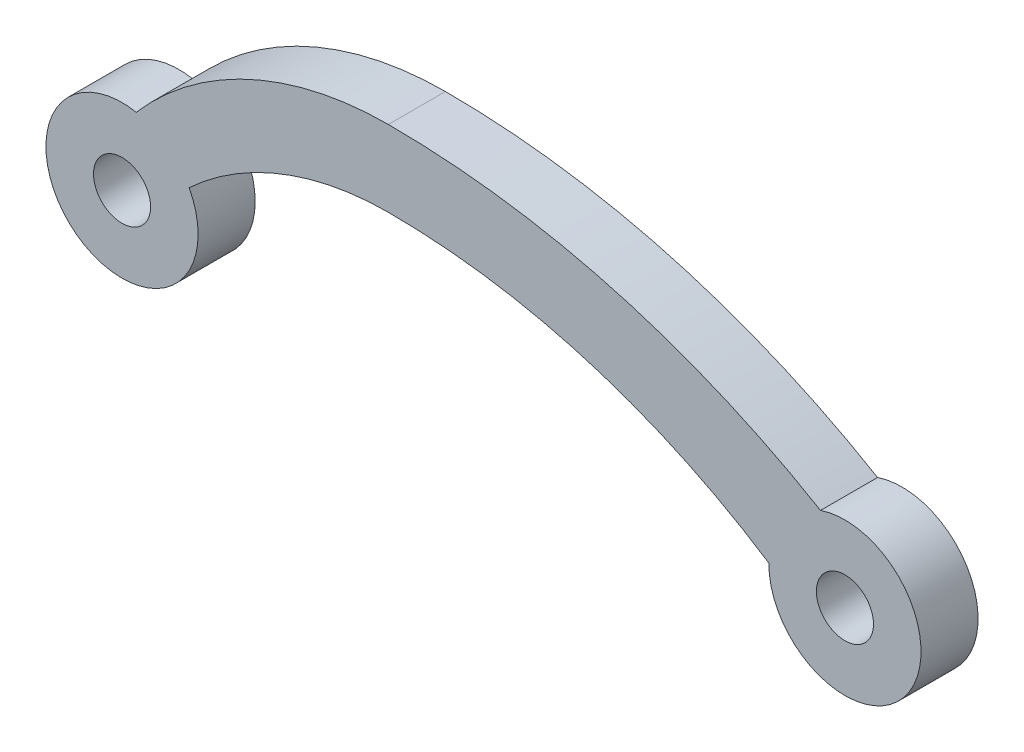
ISO-10303-21;
HEADER;
FILE_DESCRIPTION(('STEP AP214'),'2;1');
FILE_NAME('part.step','',(''),(''),'','','');
FILE_SCHEMA(('AUTOMOTIVE_DESIGN { 1 0 10303 214 1 1 1 1 }'));
ENDSEC;
DATA;
#1=APPLICATION_CONTEXT('core data for automotive mechanical design processes');
#2=APPLICATION_PROTOCOL_DEFINITION('international standard','automotive_design',2000,#1);
#3=PRODUCT_CONTEXT('',#1,'mechanical');
#4=PRODUCT('Part','Part','',(#3));
#5=PRODUCT_RELATED_PRODUCT_CATEGORY('part','',(#4));
#6=PRODUCT_DEFINITION_FORMATION('','',#4);
#7=PRODUCT_DEFINITION_CONTEXT('part definition',#1,'design');
#8=PRODUCT_DEFINITION('design','',#6,#7);
#9=PRODUCT_DEFINITION_SHAPE('','',#8);
#10=(LENGTH_UNIT() NAMED_UNIT(*) SI_UNIT(.MILLI.,.METRE.));
#11=(NAMED_UNIT(*) PLANE_ANGLE_UNIT() SI_UNIT($,.RADIAN.));
#12=(NAMED_UNIT(*) SI_UNIT($,.STERADIAN.) SOLID_ANGLE_UNIT());
#13=UNCERTAINTY_MEASURE_WITH_UNIT(LENGTH_MEASURE(1.E-05),#10,'distance_accuracy_value','');
#14=(GEOMETRIC_REPRESENTATION_CONTEXT(3) GLOBAL_UNCERTAINTY_ASSIGNED_CONTEXT((#13)) GLOBAL_UNIT_ASSIGNED_CONTEXT((#10,
#11,#12)) REPRESENTATION_CONTEXT('',''));
#15=CARTESIAN_POINT('',(0.,0.,0.));
#16=DIRECTION('',(0.,0.,1.));
#17=DIRECTION('',(1.,0.,0.));
#18=AXIS2_PLACEMENT_3D('',#15,#16,#17);
#19=CARTESIAN_POINT('',(14.,-7.49999999999998,3.));
#20=DIRECTION('',(0.,0.,-1.));
#21=DIRECTION('',(-1.,0.,0.));
#22=AXIS2_PLACEMENT_3D('',#19,#20,#21);
#23=CYLINDRICAL_SURFACE('',#22,17.5);
#24=CARTESIAN_POINT('',(14.,-7.49999999999998,0.));
#25=DIRECTION('',(0.,0.,1.));
#26=DIRECTION('',(1.,0.,0.));
#27=AXIS2_PLACEMENT_3D('',#24,#25,#26);
#28=CIRCLE('',#27,17.5);
#29=CARTESIAN_POINT('',(14.,10.,0.));
#30=VERTEX_POINT('',#29);
#31=CARTESIAN_POINT('',(0.747922049501802,3.92945449240337,0.));
#32=VERTEX_POINT('',#31);
#33=EDGE_CURVE('E221',#30,#32,#28,.T.);
#34=ORIENTED_EDGE('',*,*,#33,.T.);
#35=DIRECTION('',(0.,0.,-1.));
#36=VECTOR('',#35,1.);
#37=CARTESIAN_POINT('',(0.747922049501802,3.92945449240337,3.));
#38=LINE('',#37,#36);
#39=CARTESIAN_POINT('',(0.747922049501802,3.92945449240337,3.));
#40=VERTEX_POINT('',#39);
#41=EDGE_CURVE('E141',#40,#32,#38,.T.);
#42=ORIENTED_EDGE('',*,*,#41,.F.);
#43=CARTESIAN_POINT('',(14.,-7.49999999999998,3.));
#44=DIRECTION('',(0.,0.,1.));
#45=DIRECTION('',(1.,0.,0.));
#46=AXIS2_PLACEMENT_3D('',#43,#44,#45);
#47=CIRCLE('',#46,17.5);
#48=CARTESIAN_POINT('',(14.,10.,3.));
#49=VERTEX_POINT('',#48);
#50=EDGE_CURVE('E212',#49,#40,#47,.T.);
#51=ORIENTED_EDGE('',*,*,#50,.F.);
#52=DIRECTION('',(0.,0.,-1.));
#53=VECTOR('',#52,1.);
#54=CARTESIAN_POINT('',(14.,10.,3.));
#55=LINE('',#54,#53);
#56=EDGE_CURVE('E12',#49,#30,#55,.T.);
#57=ORIENTED_EDGE('',*,*,#56,.T.);
#58=EDGE_LOOP('',(#34,#42,#51,#57));
#59=FACE_BOUND('',#58,.T.);
#60=ADVANCED_FACE('F131',(#59),#23,.T.);
#61=CARTESIAN_POINT('',(14.,-9.38888888888889,3.));
#62=DIRECTION('',(0.,0.,-1.));
#63=DIRECTION('',(-1.,0.,0.));
#64=AXIS2_PLACEMENT_3D('',#61,#62,#63);
#65=CYLINDRICAL_SURFACE('',#64,15.3888888888889);
#66=CARTESIAN_POINT('',(14.,-9.38888888888889,0.));
#67=DIRECTION('',(0.,0.,1.));
#68=DIRECTION('',(1.,0.,0.));
#69=AXIS2_PLACEMENT_3D('',#66,#67,#68);
#70=CIRCLE('',#69,15.3888888888889);
#71=CARTESIAN_POINT('',(14.,6.,0.));
#72=VERTEX_POINT('',#71);
#73=CARTESIAN_POINT('',(3.52713505013722,1.8866155777194,0.));
#74=VERTEX_POINT('',#73);
#75=EDGE_CURVE('E194',#72,#74,#70,.T.);
#76=ORIENTED_EDGE('',*,*,#75,.F.);
#77=DIRECTION('',(0.,0.,-1.));
#78=VECTOR('',#77,1.);
#79=CARTESIAN_POINT('',(14.,6.,3.));
#80=LINE('',#79,#78);
#81=CARTESIAN_POINT('',(14.,6.,3.));
#82=VERTEX_POINT('',#81);
#83=EDGE_CURVE('E188',#82,#72,#80,.T.);
#84=ORIENTED_EDGE('',*,*,#83,.F.);
#85=CARTESIAN_POINT('',(14.,-9.38888888888889,3.));
#86=DIRECTION('',(0.,0.,1.));
#87=DIRECTION('',(1.,0.,0.));
#88=AXIS2_PLACEMENT_3D('',#85,#86,#87);
#89=CIRCLE('',#88,15.3888888888889);
#90=CARTESIAN_POINT('',(3.52713505013722,1.8866155777194,3.));
#91=VERTEX_POINT('',#90);
#92=EDGE_CURVE('E192',#82,#91,#89,.T.);
#93=ORIENTED_EDGE('',*,*,#92,.T.);
#94=DIRECTION('',(0.,0.,-1.));
#95=VECTOR('',#94,1.);
#96=CARTESIAN_POINT('',(3.52713505013722,1.8866155777194,3.));
#97=LINE('',#96,#95);
#98=EDGE_CURVE('E198',#91,#74,#97,.T.);
#99=ORIENTED_EDGE('',*,*,#98,.T.);
#100=EDGE_LOOP('',(#76,#84,#93,#99));
#101=FACE_BOUND('',#100,.T.);
#102=ADVANCED_FACE('F190',(#101),#65,.F.);
#103=CARTESIAN_POINT('',(14.,-30.5,3.));
#104=DIRECTION('',(0.,0.,-1.));
#105=DIRECTION('',(-1.,0.,0.));
#106=AXIS2_PLACEMENT_3D('',#103,#104,#105);
#107=CYLINDRICAL_SURFACE('',#106,36.5);
#108=CARTESIAN_POINT('',(14.,-30.5,0.));
#109=DIRECTION('',(0.,0.,1.));
#110=DIRECTION('',(1.,0.,0.));
#111=AXIS2_PLACEMENT_3D('',#108,#109,#110);
#112=CIRCLE('',#111,36.5);
#113=CARTESIAN_POINT('',(34.0001335149333,0.0326818243147403,0.));
#114=VERTEX_POINT('',#113);
#115=EDGE_CURVE('E225',#72,#114,#112,.F.);
#116=ORIENTED_EDGE('',*,*,#115,.T.);
#117=DIRECTION('',(0.,0.,-1.));
#118=VECTOR('',#117,1.);
#119=CARTESIAN_POINT('',(34.0001335149333,0.0326818243147403,3.));
#120=LINE('',#119,#118);
#121=CARTESIAN_POINT('',(34.0001335149333,0.0326818243147403,3.));
#122=VERTEX_POINT('',#121);
#123=EDGE_CURVE('E169',#122,#114,#120,.T.);
#124=ORIENTED_EDGE('',*,*,#123,.F.);
#125=CARTESIAN_POINT('',(14.,-30.5,3.));
#126=DIRECTION('',(0.,0.,1.));
#127=DIRECTION('',(1.,0.,0.));
#128=AXIS2_PLACEMENT_3D('',#125,#126,#127);
#129=CIRCLE('',#128,36.5);
#130=EDGE_CURVE('E201',#82,#122,#129,.F.);
#131=ORIENTED_EDGE('',*,*,#130,.F.);
#132=ORIENTED_EDGE('',*,*,#83,.T.);
#133=EDGE_LOOP('',(#116,#124,#131,#132));
#134=FACE_BOUND('',#133,.T.);
#135=ADVANCED_FACE('F202',(#134),#107,.F.);
#136=CARTESIAN_POINT('',(14.,-34.6428571428571,3.));
#137=DIRECTION('',(0.,0.,-1.));
#138=DIRECTION('',(-1.,0.,0.));
#139=AXIS2_PLACEMENT_3D('',#136,#137,#138);
#140=CYLINDRICAL_SURFACE('',#139,44.6428571428571);
#141=CARTESIAN_POINT('',(14.,-34.6428571428571,0.));
#142=DIRECTION('',(0.,0.,1.));
#143=DIRECTION('',(1.,0.,0.));
#144=AXIS2_PLACEMENT_3D('',#141,#142,#143);
#145=CIRCLE('',#144,44.6428571428571);
#146=CARTESIAN_POINT('',(36.7161805925139,3.78837798126875,0.));
#147=VERTEX_POINT('',#146);
#148=EDGE_CURVE('E218',#30,#147,#145,.F.);
#149=ORIENTED_EDGE('',*,*,#148,.F.);
#150=ORIENTED_EDGE('',*,*,#56,.F.);
#151=CARTESIAN_POINT('',(14.,-34.6428571428571,3.));
#152=DIRECTION('',(0.,0.,1.));
#153=DIRECTION('',(1.,0.,0.));
#154=AXIS2_PLACEMENT_3D('',#151,#152,#153);
#155=CIRCLE('',#154,44.6428571428571);
#156=CARTESIAN_POINT('',(36.7161805925139,3.78837798126875,3.));
#157=VERTEX_POINT('',#156);
#158=EDGE_CURVE('E214',#49,#157,#155,.F.);
#159=ORIENTED_EDGE('',*,*,#158,.T.);
#160=DIRECTION('',(0.,0.,-1.));
#161=VECTOR('',#160,1.);
#162=CARTESIAN_POINT('',(36.7161805925139,3.78837798126875,3.));
#163=LINE('',#162,#161);
#164=EDGE_CURVE('E150',#157,#147,#163,.T.);
#165=ORIENTED_EDGE('',*,*,#164,.T.);
#166=EDGE_LOOP('',(#149,#150,#159,#165));
#167=FACE_BOUND('',#166,.T.);
#168=ADVANCED_FACE('F252',(#167),#140,.T.);
#169=CARTESIAN_POINT('',(0.,0.,0.));
#170=DIRECTION('',(0.,0.,1.));
#171=DIRECTION('',(1.,0.,0.));
#172=AXIS2_PLACEMENT_3D('',#169,#170,#171);
#173=PLANE('',#172);
#174=ORIENTED_EDGE('',*,*,#148,.T.);
#175=CARTESIAN_POINT('',(38.,0.,0.));
#176=DIRECTION('',(0.,0.,1.));
#177=DIRECTION('',(1.,0.,0.));
#178=AXIS2_PLACEMENT_3D('',#175,#176,#177);
#179=CIRCLE('',#178,4.);
#180=EDGE_CURVE('E135',#114,#147,#179,.T.);
#181=ORIENTED_EDGE('',*,*,#180,.F.);
#182=ORIENTED_EDGE('',*,*,#115,.F.);
#183=ORIENTED_EDGE('',*,*,#75,.T.);
#184=CARTESIAN_POINT('',(0.,0.,0.));
#185=DIRECTION('',(0.,0.,1.));
#186=DIRECTION('',(1.,0.,0.));
#187=AXIS2_PLACEMENT_3D('',#184,#185,#186);
#188=CIRCLE('',#187,4.);
#189=EDGE_CURVE('E234',#32,#74,#188,.T.);
#190=ORIENTED_EDGE('',*,*,#189,.F.);
#191=ORIENTED_EDGE('',*,*,#33,.F.);
#192=EDGE_LOOP('',(#174,#181,#182,#183,#190,#191));
#193=FACE_BOUND('',#192,.T.);
#194=CARTESIAN_POINT('',(38.,0.,0.));
#195=DIRECTION('',(0.,0.,1.));
#196=DIRECTION('',(1.,0.,0.));
#197=AXIS2_PLACEMENT_3D('',#194,#195,#196);
#198=CIRCLE('',#197,1.5);
#199=CARTESIAN_POINT('',(39.5,0.,0.));
#200=VERTEX_POINT('',#199);
#201=EDGE_CURVE('E245',#200,#200,#198,.T.);
#202=ORIENTED_EDGE('',*,*,#201,.T.);
#203=EDGE_LOOP('',(#202));
#204=FACE_BOUND('',#203,.T.);
#205=CARTESIAN_POINT('',(0.,0.,0.));
#206=DIRECTION('',(0.,0.,1.));
#207=DIRECTION('',(1.,0.,0.));
#208=AXIS2_PLACEMENT_3D('',#205,#206,#207);
#209=CIRCLE('',#208,1.5);
#210=CARTESIAN_POINT('',(1.5,0.,0.));
#211=VERTEX_POINT('',#210);
#212=EDGE_CURVE('E235',#211,#211,#209,.T.);
#213=ORIENTED_EDGE('',*,*,#212,.T.);
#214=EDGE_LOOP('',(#213));
#215=FACE_BOUND('',#214,.T.);
#216=ADVANCED_FACE('F249',(#193,#204,#215),#173,.F.);
#217=CARTESIAN_POINT('',(0.,0.,3.));
#218=DIRECTION('',(0.,0.,1.));
#219=DIRECTION('',(1.,0.,0.));
#220=AXIS2_PLACEMENT_3D('',#217,#218,#219);
#221=PLANE('',#220);
#222=ORIENTED_EDGE('',*,*,#158,.F.);
#223=ORIENTED_EDGE('',*,*,#50,.T.);
#224=CARTESIAN_POINT('',(0.,0.,3.));
#225=DIRECTION('',(0.,0.,1.));
#226=DIRECTION('',(1.,0.,0.));
#227=AXIS2_PLACEMENT_3D('',#224,#225,#226);
#228=CIRCLE('',#227,4.);
#229=EDGE_CURVE('E211',#40,#91,#228,.T.);
#230=ORIENTED_EDGE('',*,*,#229,.T.);
#231=ORIENTED_EDGE('',*,*,#92,.F.);
#232=ORIENTED_EDGE('',*,*,#130,.T.);
#233=CARTESIAN_POINT('',(38.,0.,3.));
#234=DIRECTION('',(0.,0.,1.));
#235=DIRECTION('',(1.,0.,0.));
#236=AXIS2_PLACEMENT_3D('',#233,#234,#235);
#237=CIRCLE('',#236,4.);
#238=EDGE_CURVE('E238',#122,#157,#237,.T.);
#239=ORIENTED_EDGE('',*,*,#238,.T.);
#240=EDGE_LOOP('',(#222,#223,#230,#231,#232,#239));
#241=FACE_BOUND('',#240,.T.);
#242=CARTESIAN_POINT('',(38.,0.,3.));
#243=DIRECTION('',(0.,0.,1.));
#244=DIRECTION('',(1.,0.,0.));
#245=AXIS2_PLACEMENT_3D('',#242,#243,#244);
#246=CIRCLE('',#245,1.5);
#247=CARTESIAN_POINT('',(39.5,0.,3.));
#248=VERTEX_POINT('',#247);
#249=EDGE_CURVE('E242',#248,#248,#246,.T.);
#250=ORIENTED_EDGE('',*,*,#249,.F.);
#251=EDGE_LOOP('',(#250));
#252=FACE_BOUND('',#251,.T.);
#253=CARTESIAN_POINT('',(0.,0.,3.));
#254=DIRECTION('',(0.,0.,1.));
#255=DIRECTION('',(1.,0.,0.));
#256=AXIS2_PLACEMENT_3D('',#253,#254,#255);
#257=CIRCLE('',#256,1.5);
#258=CARTESIAN_POINT('',(1.5,0.,3.));
#259=VERTEX_POINT('',#258);
#260=EDGE_CURVE('E231',#259,#259,#257,.T.);
#261=ORIENTED_EDGE('',*,*,#260,.F.);
#262=EDGE_LOOP('',(#261));
#263=FACE_BOUND('',#262,.T.);
#264=ADVANCED_FACE('F207',(#241,#252,#263),#221,.T.);
#265=CARTESIAN_POINT('',(38.,0.,3.));
#266=DIRECTION('',(0.,0.,-1.));
#267=DIRECTION('',(-1.,0.,0.));
#268=AXIS2_PLACEMENT_3D('',#265,#266,#267);
#269=CYLINDRICAL_SURFACE('',#268,1.5);
#270=ORIENTED_EDGE('',*,*,#249,.T.);
#271=EDGE_LOOP('',(#270));
#272=FACE_BOUND('',#271,.T.);
#273=ORIENTED_EDGE('',*,*,#201,.F.);
#274=EDGE_LOOP('',(#273));
#275=FACE_BOUND('',#274,.T.);
#276=ADVANCED_FACE('F271',(#272,#275),#269,.F.);
#277=CARTESIAN_POINT('',(38.,0.,3.));
#278=DIRECTION('',(0.,0.,-1.));
#279=DIRECTION('',(-1.,0.,0.));
#280=AXIS2_PLACEMENT_3D('',#277,#278,#279);
#281=CYLINDRICAL_SURFACE('',#280,4.);
#282=ORIENTED_EDGE('',*,*,#164,.F.);
#283=ORIENTED_EDGE('',*,*,#238,.F.);
#284=ORIENTED_EDGE('',*,*,#123,.T.);
#285=ORIENTED_EDGE('',*,*,#180,.T.);
#286=EDGE_LOOP('',(#282,#283,#284,#285));
#287=FACE_BOUND('',#286,.T.);
#288=ADVANCED_FACE('F133',(#287),#281,.T.);
#289=CARTESIAN_POINT('',(0.,0.,3.));
#290=DIRECTION('',(0.,0.,-1.));
#291=DIRECTION('',(-1.,0.,0.));
#292=AXIS2_PLACEMENT_3D('',#289,#290,#291);
#293=CYLINDRICAL_SURFACE('',#292,1.5);
#294=ORIENTED_EDGE('',*,*,#260,.T.);
#295=EDGE_LOOP('',(#294));
#296=FACE_BOUND('',#295,.T.);
#297=ORIENTED_EDGE('',*,*,#212,.F.);
#298=EDGE_LOOP('',(#297));
#299=FACE_BOUND('',#298,.T.);
#300=ADVANCED_FACE('F278',(#296,#299),#293,.F.);
#301=CARTESIAN_POINT('',(0.,0.,3.));
#302=DIRECTION('',(0.,0.,-1.));
#303=DIRECTION('',(-1.,0.,0.));
#304=AXIS2_PLACEMENT_3D('',#301,#302,#303);
#305=CYLINDRICAL_SURFACE('',#304,4.);
#306=ORIENTED_EDGE('',*,*,#229,.F.);
#307=ORIENTED_EDGE('',*,*,#41,.T.);
#308=ORIENTED_EDGE('',*,*,#189,.T.);
#309=ORIENTED_EDGE('',*,*,#98,.F.);
#310=EDGE_LOOP('',(#306,#307,#308,#309));
#311=FACE_BOUND('',#310,.T.);
#312=ADVANCED_FACE('F276',(#311),#305,.T.);
#313=CLOSED_SHELL('',(#60,#102,#135,#168,#216,#264,#276,#288,#300,#312));
#314=MANIFOLD_SOLID_BREP('B2',#313);
#315=ADVANCED_BREP_SHAPE_REPRESENTATION('',(#18,#314),#14);
#316=SHAPE_DEFINITION_REPRESENTATION(#9,#315);
ENDSEC;
END-ISO-10303-21;
